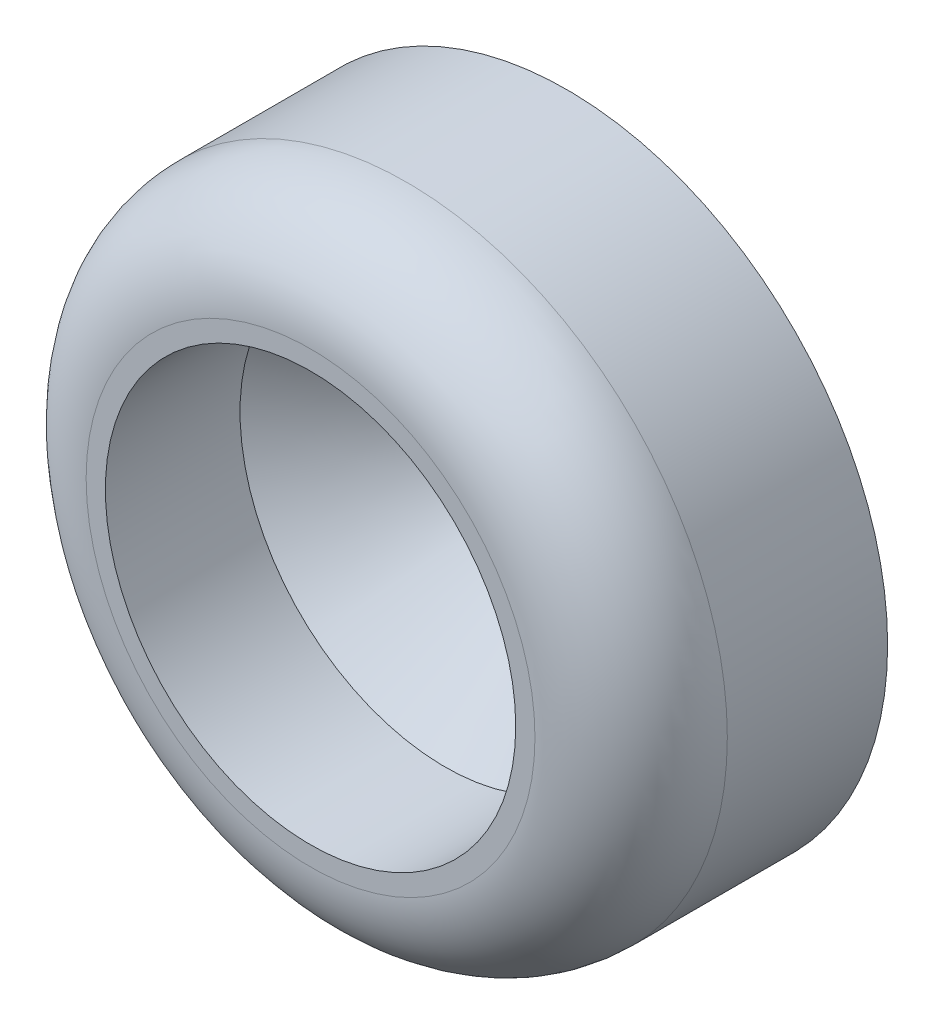
ISO-10303-21;
HEADER;
FILE_DESCRIPTION(('STEP AP214'),'2;1');
FILE_NAME('part.step','',(''),(''),'','','');
FILE_SCHEMA(('AUTOMOTIVE_DESIGN { 1 0 10303 214 1 1 1 1 }'));
ENDSEC;
DATA;
#1=APPLICATION_CONTEXT('core data for automotive mechanical design processes');
#2=APPLICATION_PROTOCOL_DEFINITION('international standard','automotive_design',2000,#1);
#3=PRODUCT_CONTEXT('',#1,'mechanical');
#4=PRODUCT('Part','Part','',(#3));
#5=PRODUCT_RELATED_PRODUCT_CATEGORY('part','',(#4));
#6=PRODUCT_DEFINITION_FORMATION('','',#4);
#7=PRODUCT_DEFINITION_CONTEXT('part definition',#1,'design');
#8=PRODUCT_DEFINITION('design','',#6,#7);
#9=PRODUCT_DEFINITION_SHAPE('','',#8);
#10=(LENGTH_UNIT() NAMED_UNIT(*) SI_UNIT(.MILLI.,.METRE.));
#11=(NAMED_UNIT(*) PLANE_ANGLE_UNIT() SI_UNIT($,.RADIAN.));
#12=(NAMED_UNIT(*) SI_UNIT($,.STERADIAN.) SOLID_ANGLE_UNIT());
#13=UNCERTAINTY_MEASURE_WITH_UNIT(LENGTH_MEASURE(1.E-05),#10,'distance_accuracy_value','');
#14=(GEOMETRIC_REPRESENTATION_CONTEXT(3) GLOBAL_UNCERTAINTY_ASSIGNED_CONTEXT((#13)) GLOBAL_UNIT_ASSIGNED_CONTEXT((#10,
#11,#12)) REPRESENTATION_CONTEXT('',''));
#15=CARTESIAN_POINT('',(0.,0.,0.));
#16=DIRECTION('',(0.,0.,1.));
#17=DIRECTION('',(1.,0.,0.));
#18=AXIS2_PLACEMENT_3D('',#15,#16,#17);
#19=CARTESIAN_POINT('',(0.,0.,4.));
#20=DIRECTION('',(0.,0.,-1.));
#21=DIRECTION('',(-1.,0.,0.));
#22=AXIS2_PLACEMENT_3D('',#19,#20,#21);
#23=CYLINDRICAL_SURFACE('',#22,1.6);
#24=CARTESIAN_POINT('',(0.,0.,0.299999999999969));
#25=DIRECTION('',(0.,0.,1.));
#26=DIRECTION('',(1.,0.,0.));
#27=AXIS2_PLACEMENT_3D('',#24,#25,#26);
#28=CIRCLE('',#27,1.6);
#29=CARTESIAN_POINT('',(1.6,0.,0.299999999999969));
#30=VERTEX_POINT('',#29);
#31=EDGE_CURVE('E49',#30,#30,#28,.T.);
#32=ORIENTED_EDGE('',*,*,#31,.T.);
#33=EDGE_LOOP('',(#32));
#34=FACE_BOUND('',#33,.T.);
#35=CARTESIAN_POINT('',(0.,0.,0.));
#36=DIRECTION('',(0.,0.,1.));
#37=DIRECTION('',(1.,0.,0.));
#38=AXIS2_PLACEMENT_3D('',#35,#36,#37);
#39=CIRCLE('',#38,1.6);
#40=CARTESIAN_POINT('',(1.6,0.,0.));
#41=VERTEX_POINT('',#40);
#42=EDGE_CURVE('E57',#41,#41,#39,.T.);
#43=ORIENTED_EDGE('',*,*,#42,.F.);
#44=EDGE_LOOP('',(#43));
#45=FACE_BOUND('',#44,.T.);
#46=ADVANCED_FACE('F34',(#34,#45),#23,.F.);
#47=CARTESIAN_POINT('',(0.,0.,4.));
#48=DIRECTION('',(0.,0.,1.));
#49=DIRECTION('',(1.,0.,0.));
#50=AXIS2_PLACEMENT_3D('',#47,#48,#49);
#51=PLANE('',#50);
#52=CARTESIAN_POINT('',(0.,0.,4.));
#53=DIRECTION('',(0.,0.,1.));
#54=DIRECTION('',(1.,0.,0.));
#55=AXIS2_PLACEMENT_3D('',#52,#53,#54);
#56=CIRCLE('',#55,3.5);
#57=CARTESIAN_POINT('',(3.5,0.,4.));
#58=VERTEX_POINT('',#57);
#59=EDGE_CURVE('E41',#58,#58,#56,.T.);
#60=ORIENTED_EDGE('',*,*,#59,.T.);
#61=EDGE_LOOP('',(#60));
#62=FACE_BOUND('',#61,.T.);
#63=CARTESIAN_POINT('',(0.,0.,4.));
#64=DIRECTION('',(0.,0.,1.));
#65=DIRECTION('',(1.,0.,0.));
#66=AXIS2_PLACEMENT_3D('',#63,#64,#65);
#67=CIRCLE('',#66,3.2);
#68=CARTESIAN_POINT('',(3.2,0.,4.));
#69=VERTEX_POINT('',#68);
#70=EDGE_CURVE('E60',#69,#69,#67,.T.);
#71=ORIENTED_EDGE('',*,*,#70,.F.);
#72=EDGE_LOOP('',(#71));
#73=FACE_BOUND('',#72,.T.);
#74=ADVANCED_FACE('F66',(#62,#73),#51,.T.);
#75=CARTESIAN_POINT('',(0.,0.,0.));
#76=DIRECTION('',(0.,0.,1.));
#77=DIRECTION('',(1.,0.,0.));
#78=AXIS2_PLACEMENT_3D('',#75,#76,#77);
#79=PLANE('',#78);
#80=CARTESIAN_POINT('',(0.,0.,0.));
#81=DIRECTION('',(0.,0.,1.));
#82=DIRECTION('',(1.,0.,0.));
#83=AXIS2_PLACEMENT_3D('',#80,#81,#82);
#84=CIRCLE('',#83,5.);
#85=CARTESIAN_POINT('',(5.,0.,0.));
#86=VERTEX_POINT('',#85);
#87=EDGE_CURVE('E54',#86,#86,#84,.T.);
#88=ORIENTED_EDGE('',*,*,#87,.F.);
#89=EDGE_LOOP('',(#88));
#90=FACE_BOUND('',#89,.T.);
#91=ORIENTED_EDGE('',*,*,#42,.T.);
#92=EDGE_LOOP('',(#91));
#93=FACE_BOUND('',#92,.T.);
#94=ADVANCED_FACE('F68',(#90,#93),#79,.F.);
#95=CARTESIAN_POINT('',(0.,0.,4.));
#96=DIRECTION('',(0.,0.,-1.));
#97=DIRECTION('',(-1.,0.,0.));
#98=AXIS2_PLACEMENT_3D('',#95,#96,#97);
#99=CYLINDRICAL_SURFACE('',#98,5.);
#100=CARTESIAN_POINT('',(0.,0.,2.5));
#101=DIRECTION('',(0.,0.,1.));
#102=DIRECTION('',(1.,0.,0.));
#103=AXIS2_PLACEMENT_3D('',#100,#101,#102);
#104=CIRCLE('',#103,5.);
#105=CARTESIAN_POINT('',(5.,0.,2.5));
#106=VERTEX_POINT('',#105);
#107=EDGE_CURVE('E11',#106,#106,#104,.F.);
#108=ORIENTED_EDGE('',*,*,#107,.T.);
#109=EDGE_LOOP('',(#108));
#110=FACE_BOUND('',#109,.T.);
#111=ORIENTED_EDGE('',*,*,#87,.T.);
#112=EDGE_LOOP('',(#111));
#113=FACE_BOUND('',#112,.T.);
#114=ADVANCED_FACE('F74',(#110,#113),#99,.T.);
#115=CARTESIAN_POINT('',(0.,0.,-9.05096679918781));
#116=DIRECTION('',(0.,0.,1.));
#117=DIRECTION('',(1.,0.,0.));
#118=AXIS2_PLACEMENT_3D('',#115,#116,#117);
#119=CYLINDRICAL_SURFACE('',#118,3.2);
#120=CARTESIAN_POINT('',(0.,0.,1.89999999999999));
#121=DIRECTION('',(0.,0.,1.));
#122=DIRECTION('',(1.,0.,0.));
#123=AXIS2_PLACEMENT_3D('',#120,#121,#122);
#124=CIRCLE('',#123,3.2);
#125=CARTESIAN_POINT('',(3.2,0.,1.89999999999999));
#126=VERTEX_POINT('',#125);
#127=EDGE_CURVE('E45',#126,#126,#124,.F.);
#128=ORIENTED_EDGE('',*,*,#127,.T.);
#129=EDGE_LOOP('',(#128));
#130=FACE_BOUND('',#129,.T.);
#131=ORIENTED_EDGE('',*,*,#70,.T.);
#132=EDGE_LOOP('',(#131));
#133=FACE_BOUND('',#132,.T.);
#134=ADVANCED_FACE('F64',(#130,#133),#119,.F.);
#135=CARTESIAN_POINT('',(0.,0.,0.299999999999969));
#136=DIRECTION('',(0.,0.,1.));
#137=DIRECTION('',(1.,0.,0.));
#138=AXIS2_PLACEMENT_3D('',#135,#136,#137);
#139=CONICAL_SURFACE('',#138,1.6,0.785398163397443);
#140=CARTESIAN_POINT('',(3.2,0.,1.89999999999999));
#141=CARTESIAN_POINT('',(3.18333333333333,0.,1.88333333333332));
#142=CARTESIAN_POINT('',(3.16666666666667,0.,1.86666666666665));
#143=CARTESIAN_POINT('',(3.13333333333333,0.,1.83333333333332));
#144=CARTESIAN_POINT('',(3.11666666666667,0.,1.81666666666665));
#145=CARTESIAN_POINT('',(3.08333333333333,0.,1.78333333333332));
#146=CARTESIAN_POINT('',(3.06666666666667,0.,1.76666666666665));
#147=CARTESIAN_POINT('',(3.03333333333333,0.,1.73333333333332));
#148=CARTESIAN_POINT('',(3.01666666666667,0.,1.71666666666665));
#149=CARTESIAN_POINT('',(2.98333333333333,0.,1.68333333333332));
#150=CARTESIAN_POINT('',(2.96666666666667,0.,1.66666666666665));
#151=CARTESIAN_POINT('',(2.93333333333333,0.,1.63333333333332));
#152=CARTESIAN_POINT('',(2.91666666666667,0.,1.61666666666665));
#153=CARTESIAN_POINT('',(2.88333333333333,0.,1.58333333333332));
#154=CARTESIAN_POINT('',(2.86666666666667,0.,1.56666666666665));
#155=CARTESIAN_POINT('',(2.83333333333333,0.,1.53333333333331));
#156=CARTESIAN_POINT('',(2.81666666666667,0.,1.51666666666665));
#157=CARTESIAN_POINT('',(2.78333333333333,0.,1.48333333333331));
#158=CARTESIAN_POINT('',(2.76666666666667,0.,1.46666666666665));
#159=CARTESIAN_POINT('',(2.73333333333333,0.,1.43333333333331));
#160=CARTESIAN_POINT('',(2.71666666666667,0.,1.41666666666665));
#161=CARTESIAN_POINT('',(2.68333333333333,0.,1.38333333333331));
#162=CARTESIAN_POINT('',(2.66666666666667,0.,1.36666666666665));
#163=CARTESIAN_POINT('',(2.63333333333333,0.,1.33333333333331));
#164=CARTESIAN_POINT('',(2.61666666666667,0.,1.31666666666665));
#165=CARTESIAN_POINT('',(2.58333333333333,0.,1.28333333333331));
#166=CARTESIAN_POINT('',(2.56666666666667,0.,1.26666666666665));
#167=CARTESIAN_POINT('',(2.53333333333333,0.,1.23333333333331));
#168=CARTESIAN_POINT('',(2.51666666666667,0.,1.21666666666665));
#169=CARTESIAN_POINT('',(2.48333333333333,0.,1.18333333333331));
#170=CARTESIAN_POINT('',(2.46666666666667,0.,1.16666666666664));
#171=CARTESIAN_POINT('',(2.43333333333333,0.,1.13333333333331));
#172=CARTESIAN_POINT('',(2.41666666666667,0.,1.11666666666664));
#173=CARTESIAN_POINT('',(2.38333333333333,0.,1.08333333333331));
#174=CARTESIAN_POINT('',(2.36666666666667,0.,1.06666666666664));
#175=CARTESIAN_POINT('',(2.33333333333333,0.,1.03333333333331));
#176=CARTESIAN_POINT('',(2.31666666666667,0.,1.01666666666664));
#177=CARTESIAN_POINT('',(2.28333333333333,0.,0.983333333333309));
#178=CARTESIAN_POINT('',(2.26666666666667,0.,0.966666666666642));
#179=CARTESIAN_POINT('',(2.23333333333333,0.,0.933333333333308));
#180=CARTESIAN_POINT('',(2.21666666666667,0.,0.916666666666642));
#181=CARTESIAN_POINT('',(2.18333333333333,0.,0.883333333333308));
#182=CARTESIAN_POINT('',(2.16666666666667,0.,0.866666666666641));
#183=CARTESIAN_POINT('',(2.13333333333333,0.,0.833333333333308));
#184=CARTESIAN_POINT('',(2.11666666666667,0.,0.816666666666641));
#185=CARTESIAN_POINT('',(2.08333333333333,0.,0.783333333333307));
#186=CARTESIAN_POINT('',(2.06666666666667,0.,0.76666666666664));
#187=CARTESIAN_POINT('',(2.03333333333333,0.,0.733333333333307));
#188=CARTESIAN_POINT('',(2.01666666666667,0.,0.71666666666664));
#189=CARTESIAN_POINT('',(1.98333333333333,0.,0.683333333333306));
#190=CARTESIAN_POINT('',(1.96666666666667,0.,0.666666666666639));
#191=CARTESIAN_POINT('',(1.93333333333333,0.,0.633333333333306));
#192=CARTESIAN_POINT('',(1.91666666666667,0.,0.616666666666639));
#193=CARTESIAN_POINT('',(1.88333333333333,0.,0.583333333333305));
#194=CARTESIAN_POINT('',(1.86666666666667,0.,0.566666666666638));
#195=CARTESIAN_POINT('',(1.83333333333333,0.,0.533333333333304));
#196=CARTESIAN_POINT('',(1.81666666666667,0.,0.516666666666638));
#197=CARTESIAN_POINT('',(1.78333333333333,0.,0.483333333333304));
#198=CARTESIAN_POINT('',(1.76666666666667,0.,0.466666666666637));
#199=CARTESIAN_POINT('',(1.73333333333333,0.,0.433333333333303));
#200=CARTESIAN_POINT('',(1.71666666666667,0.,0.416666666666637));
#201=CARTESIAN_POINT('',(1.68333333333333,0.,0.383333333333303));
#202=CARTESIAN_POINT('',(1.66666666666667,0.,0.366666666666636));
#203=CARTESIAN_POINT('',(1.63333333333333,0.,0.333333333333302));
#204=CARTESIAN_POINT('',(1.61666666666667,0.,0.316666666666635));
#205=CARTESIAN_POINT('',(1.6,0.,0.299999999999969));
#206=B_SPLINE_CURVE_WITH_KNOTS('',3,(#140,#141,#142,#143,#144,#145,#146,#147,#148,#149,#150,
#151,#152,#153,#154,#155,#156,#157,#158,#159,#160,#161,#162,#163,#164,#165,#166,#167,#168,#169,
#170,#171,#172,#173,#174,#175,#176,#177,#178,#179,#180,#181,#182,#183,#184,#185,#186,#187,#188,
#189,#190,#191,#192,#193,#194,#195,#196,#197,#198,#199,#200,#201,#202,#203,#204,#205),
.UNSPECIFIED.,.F.,.F.,(4,2,2,2,2,2,2,2,2,2,2,2,2,2,2,2,2,2,2,2,2,2,2,2,2,2,2,2,2,2,2,2,4),(0.,
0.0707106781186556,0.141421356237311,0.212132034355966,0.282842712474621,0.353553390593276,
0.424264068711931,0.494974746830586,0.565685424949241,0.636396103067896,0.707106781186552,
0.777817459305207,0.848528137423862,0.919238815542517,0.989949493661172,1.06066017177983,
1.13137084989848,1.20208152801714,1.27279220613579,1.34350288425445,1.4142135623731,
1.48492424049176,1.55563491861041,1.62634559672907,1.69705627484772,1.76776695296638,
1.83847763108503,1.90918830920369,1.97989898732234,2.050609665441,2.12132034355965,
2.19203102167831,2.26274169979696),.UNSPECIFIED.);
#207=EDGE_CURVE('BSEAM82',#126,#30,#206,.T.);
#208=ORIENTED_EDGE('',*,*,#127,.F.);
#209=ORIENTED_EDGE('',*,*,#31,.F.);
#210=ORIENTED_EDGE('',*,*,#207,.T.);
#211=ORIENTED_EDGE('',*,*,#207,.F.);
#212=EDGE_LOOP('',(#208,#210,#209,#211));
#213=FACE_BOUND('',#212,.T.);
#214=ADVANCED_FACE('F82',(#213),#139,.F.);
#215=CARTESIAN_POINT('',(0.,0.,2.5));
#216=DIRECTION('',(0.,0.,1.));
#217=DIRECTION('',(1.,0.,0.));
#218=AXIS2_PLACEMENT_3D('',#215,#216,#217);
#219=TOROIDAL_SURFACE('',#218,3.5,1.5);
#220=ORIENTED_EDGE('',*,*,#107,.F.);
#221=EDGE_LOOP('',(#220));
#222=FACE_BOUND('',#221,.T.);
#223=ORIENTED_EDGE('',*,*,#59,.F.);
#224=EDGE_LOOP('',(#223));
#225=FACE_BOUND('',#224,.T.);
#226=ADVANCED_FACE('F36',(#222,#225),#219,.T.);
#227=CLOSED_SHELL('',(#46,#74,#94,#114,#134,#214,#226));
#228=MANIFOLD_SOLID_BREP('B2',#227);
#229=ADVANCED_BREP_SHAPE_REPRESENTATION('',(#18,#228),#14);
#230=SHAPE_DEFINITION_REPRESENTATION(#9,#229);
ENDSEC;
END-ISO-10303-21;
